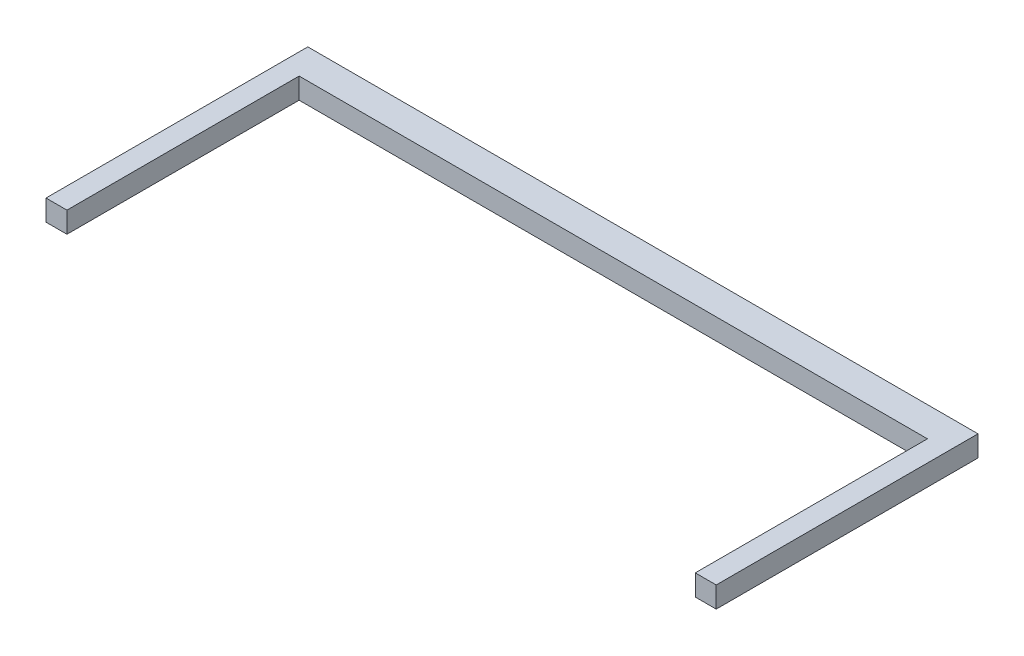
ISO-10303-21;
HEADER;
FILE_DESCRIPTION(('STEP AP214'),'2;1');
FILE_NAME('part.step','',(''),(''),'','','');
FILE_SCHEMA(('AUTOMOTIVE_DESIGN { 1 0 10303 214 1 1 1 1 }'));
ENDSEC;
DATA;
#1=APPLICATION_CONTEXT('core data for automotive mechanical design processes');
#2=APPLICATION_PROTOCOL_DEFINITION('international standard','automotive_design',2000,#1);
#3=PRODUCT_CONTEXT('',#1,'mechanical');
#4=PRODUCT('Part','Part','',(#3));
#5=PRODUCT_RELATED_PRODUCT_CATEGORY('part','',(#4));
#6=PRODUCT_DEFINITION_FORMATION('','',#4);
#7=PRODUCT_DEFINITION_CONTEXT('part definition',#1,'design');
#8=PRODUCT_DEFINITION('design','',#6,#7);
#9=PRODUCT_DEFINITION_SHAPE('','',#8);
#10=(LENGTH_UNIT() NAMED_UNIT(*) SI_UNIT(.MILLI.,.METRE.));
#11=(NAMED_UNIT(*) PLANE_ANGLE_UNIT() SI_UNIT($,.RADIAN.));
#12=(NAMED_UNIT(*) SI_UNIT($,.STERADIAN.) SOLID_ANGLE_UNIT());
#13=UNCERTAINTY_MEASURE_WITH_UNIT(LENGTH_MEASURE(1.E-05),#10,'distance_accuracy_value','');
#14=(GEOMETRIC_REPRESENTATION_CONTEXT(3) GLOBAL_UNCERTAINTY_ASSIGNED_CONTEXT((#13)) GLOBAL_UNIT_ASSIGNED_CONTEXT((#10,
#11,#12)) REPRESENTATION_CONTEXT('',''));
#15=CARTESIAN_POINT('',(0.,0.,0.));
#16=DIRECTION('',(0.,0.,1.));
#17=DIRECTION('',(1.,0.,0.));
#18=AXIS2_PLACEMENT_3D('',#15,#16,#17);
#19=CARTESIAN_POINT('',(0.,20.,0.));
#20=DIRECTION('',(1.,0.,0.));
#21=DIRECTION('',(0.,0.,-1.));
#22=AXIS2_PLACEMENT_3D('',#19,#20,#21);
#23=PLANE('',#22);
#24=DIRECTION('',(0.,0.,1.));
#25=VECTOR('',#24,1.);
#26=CARTESIAN_POINT('',(0.,0.,0.));
#27=LINE('',#26,#25);
#28=CARTESIAN_POINT('',(0.,0.,0.));
#29=VERTEX_POINT('',#28);
#30=CARTESIAN_POINT('',(0.,0.,250.));
#31=VERTEX_POINT('',#30);
#32=EDGE_CURVE('E133',#29,#31,#27,.T.);
#33=ORIENTED_EDGE('',*,*,#32,.T.);
#34=DIRECTION('',(0.,-1.,0.));
#35=VECTOR('',#34,1.);
#36=CARTESIAN_POINT('',(0.,20.,250.));
#37=LINE('',#36,#35);
#38=CARTESIAN_POINT('',(0.,20.,250.));
#39=VERTEX_POINT('',#38);
#40=EDGE_CURVE('E41',#39,#31,#37,.T.);
#41=ORIENTED_EDGE('',*,*,#40,.F.);
#42=DIRECTION('',(0.,0.,1.));
#43=VECTOR('',#42,1.);
#44=CARTESIAN_POINT('',(0.,20.,0.));
#45=LINE('',#44,#43);
#46=CARTESIAN_POINT('',(0.,20.,0.));
#47=VERTEX_POINT('',#46);
#48=EDGE_CURVE('E94',#47,#39,#45,.T.);
#49=ORIENTED_EDGE('',*,*,#48,.F.);
#50=DIRECTION('',(0.,-1.,0.));
#51=VECTOR('',#50,1.);
#52=CARTESIAN_POINT('',(0.,20.,0.));
#53=LINE('',#52,#51);
#54=EDGE_CURVE('E11',#47,#29,#53,.T.);
#55=ORIENTED_EDGE('',*,*,#54,.T.);
#56=EDGE_LOOP('',(#33,#41,#49,#55));
#57=FACE_BOUND('',#56,.T.);
#58=ADVANCED_FACE('F33',(#57),#23,.F.);
#59=CARTESIAN_POINT('',(0.,20.,250.));
#60=DIRECTION('',(0.,0.,-1.));
#61=DIRECTION('',(-1.,0.,0.));
#62=AXIS2_PLACEMENT_3D('',#59,#60,#61);
#63=PLANE('',#62);
#64=DIRECTION('',(1.,0.,0.));
#65=VECTOR('',#64,1.);
#66=CARTESIAN_POINT('',(0.,0.,250.));
#67=LINE('',#66,#65);
#68=CARTESIAN_POINT('',(20.,0.,250.));
#69=VERTEX_POINT('',#68);
#70=EDGE_CURVE('E135',#31,#69,#67,.T.);
#71=ORIENTED_EDGE('',*,*,#70,.T.);
#72=DIRECTION('',(0.,-1.,0.));
#73=VECTOR('',#72,1.);
#74=CARTESIAN_POINT('',(20.,20.,250.));
#75=LINE('',#74,#73);
#76=CARTESIAN_POINT('',(20.,20.,250.));
#77=VERTEX_POINT('',#76);
#78=EDGE_CURVE('E154',#77,#69,#75,.T.);
#79=ORIENTED_EDGE('',*,*,#78,.F.);
#80=DIRECTION('',(1.,0.,0.));
#81=VECTOR('',#80,1.);
#82=CARTESIAN_POINT('',(0.,20.,250.));
#83=LINE('',#82,#81);
#84=EDGE_CURVE('E162',#39,#77,#83,.T.);
#85=ORIENTED_EDGE('',*,*,#84,.F.);
#86=ORIENTED_EDGE('',*,*,#40,.T.);
#87=EDGE_LOOP('',(#71,#79,#85,#86));
#88=FACE_BOUND('',#87,.T.);
#89=ADVANCED_FACE('F160',(#88),#63,.F.);
#90=CARTESIAN_POINT('',(20.,20.,28.2842712474621));
#91=DIRECTION('',(-1.,0.,0.));
#92=DIRECTION('',(0.,0.,1.));
#93=AXIS2_PLACEMENT_3D('',#90,#91,#92);
#94=PLANE('',#93);
#95=DIRECTION('',(0.,0.,-1.));
#96=VECTOR('',#95,1.);
#97=CARTESIAN_POINT('',(20.,0.,28.2842712474621));
#98=LINE('',#97,#96);
#99=CARTESIAN_POINT('',(20.,0.,28.2842712474621));
#100=VERTEX_POINT('',#99);
#101=EDGE_CURVE('E138',#69,#100,#98,.T.);
#102=ORIENTED_EDGE('',*,*,#101,.T.);
#103=DIRECTION('',(0.,-1.,0.));
#104=VECTOR('',#103,1.);
#105=CARTESIAN_POINT('',(20.,20.,28.2842712474621));
#106=LINE('',#105,#104);
#107=CARTESIAN_POINT('',(20.,20.,28.2842712474621));
#108=VERTEX_POINT('',#107);
#109=EDGE_CURVE('E151',#108,#100,#106,.T.);
#110=ORIENTED_EDGE('',*,*,#109,.F.);
#111=DIRECTION('',(0.,0.,-1.));
#112=VECTOR('',#111,1.);
#113=CARTESIAN_POINT('',(20.,20.,230.));
#114=LINE('',#113,#112);
#115=EDGE_CURVE('E171',#77,#108,#114,.T.);
#116=ORIENTED_EDGE('',*,*,#115,.F.);
#117=ORIENTED_EDGE('',*,*,#78,.T.);
#118=EDGE_LOOP('',(#102,#110,#116,#117));
#119=FACE_BOUND('',#118,.T.);
#120=ADVANCED_FACE('F167',(#119),#94,.F.);
#121=CARTESIAN_POINT('',(20.,20.,28.2842712474621));
#122=DIRECTION('',(0.,0.,-1.));
#123=DIRECTION('',(-1.,0.,0.));
#124=AXIS2_PLACEMENT_3D('',#121,#122,#123);
#125=PLANE('',#124);
#126=DIRECTION('',(1.,0.,0.));
#127=VECTOR('',#126,1.);
#128=CARTESIAN_POINT('',(20.,0.,28.2842712474621));
#129=LINE('',#128,#127);
#130=CARTESIAN_POINT('',(620.,0.,28.2842712474621));
#131=VERTEX_POINT('',#130);
#132=EDGE_CURVE('E140',#100,#131,#129,.T.);
#133=ORIENTED_EDGE('',*,*,#132,.T.);
#134=DIRECTION('',(0.,-1.,0.));
#135=VECTOR('',#134,1.);
#136=CARTESIAN_POINT('',(620.,20.,28.2842712474621));
#137=LINE('',#136,#135);
#138=CARTESIAN_POINT('',(620.,20.,28.2842712474621));
#139=VERTEX_POINT('',#138);
#140=EDGE_CURVE('E122',#139,#131,#137,.T.);
#141=ORIENTED_EDGE('',*,*,#140,.F.);
#142=DIRECTION('',(1.,0.,0.));
#143=VECTOR('',#142,1.);
#144=CARTESIAN_POINT('',(20.,20.,28.2842712474621));
#145=LINE('',#144,#143);
#146=EDGE_CURVE('E114',#108,#139,#145,.T.);
#147=ORIENTED_EDGE('',*,*,#146,.F.);
#148=ORIENTED_EDGE('',*,*,#109,.T.);
#149=EDGE_LOOP('',(#133,#141,#147,#148));
#150=FACE_BOUND('',#149,.T.);
#151=ADVANCED_FACE('F170',(#150),#125,.F.);
#152=CARTESIAN_POINT('',(620.,20.,230.));
#153=DIRECTION('',(1.,0.,0.));
#154=DIRECTION('',(0.,0.,-1.));
#155=AXIS2_PLACEMENT_3D('',#152,#153,#154);
#156=PLANE('',#155);
#157=DIRECTION('',(0.,0.,1.));
#158=VECTOR('',#157,1.);
#159=CARTESIAN_POINT('',(620.,0.,230.));
#160=LINE('',#159,#158);
#161=CARTESIAN_POINT('',(620.,0.,250.));
#162=VERTEX_POINT('',#161);
#163=EDGE_CURVE('E121',#131,#162,#160,.T.);
#164=ORIENTED_EDGE('',*,*,#163,.T.);
#165=DIRECTION('',(0.,-1.,0.));
#166=VECTOR('',#165,1.);
#167=CARTESIAN_POINT('',(620.,20.,250.));
#168=LINE('',#167,#166);
#169=CARTESIAN_POINT('',(620.,20.,250.));
#170=VERTEX_POINT('',#169);
#171=EDGE_CURVE('E119',#170,#162,#168,.T.);
#172=ORIENTED_EDGE('',*,*,#171,.F.);
#173=DIRECTION('',(0.,0.,1.));
#174=VECTOR('',#173,1.);
#175=CARTESIAN_POINT('',(620.,20.,230.));
#176=LINE('',#175,#174);
#177=EDGE_CURVE('E108',#139,#170,#176,.T.);
#178=ORIENTED_EDGE('',*,*,#177,.F.);
#179=ORIENTED_EDGE('',*,*,#140,.T.);
#180=EDGE_LOOP('',(#164,#172,#178,#179));
#181=FACE_BOUND('',#180,.T.);
#182=ADVANCED_FACE('F120',(#181),#156,.F.);
#183=CARTESIAN_POINT('',(620.,20.,250.));
#184=DIRECTION('',(0.,0.,-1.));
#185=DIRECTION('',(-1.,0.,0.));
#186=AXIS2_PLACEMENT_3D('',#183,#184,#185);
#187=PLANE('',#186);
#188=DIRECTION('',(1.,0.,0.));
#189=VECTOR('',#188,1.);
#190=CARTESIAN_POINT('',(620.,0.,250.));
#191=LINE('',#190,#189);
#192=CARTESIAN_POINT('',(640.,0.,250.));
#193=VERTEX_POINT('',#192);
#194=EDGE_CURVE('E79',#162,#193,#191,.T.);
#195=ORIENTED_EDGE('',*,*,#194,.T.);
#196=DIRECTION('',(0.,-1.,0.));
#197=VECTOR('',#196,1.);
#198=CARTESIAN_POINT('',(640.,20.,250.));
#199=LINE('',#198,#197);
#200=CARTESIAN_POINT('',(640.,20.,250.));
#201=VERTEX_POINT('',#200);
#202=EDGE_CURVE('E123',#201,#193,#199,.T.);
#203=ORIENTED_EDGE('',*,*,#202,.F.);
#204=DIRECTION('',(1.,0.,0.));
#205=VECTOR('',#204,1.);
#206=CARTESIAN_POINT('',(620.,20.,250.));
#207=LINE('',#206,#205);
#208=EDGE_CURVE('E112',#170,#201,#207,.T.);
#209=ORIENTED_EDGE('',*,*,#208,.F.);
#210=ORIENTED_EDGE('',*,*,#171,.T.);
#211=EDGE_LOOP('',(#195,#203,#209,#210));
#212=FACE_BOUND('',#211,.T.);
#213=ADVANCED_FACE('F125',(#212),#187,.F.);
#214=CARTESIAN_POINT('',(640.,20.,250.));
#215=DIRECTION('',(-1.,0.,0.));
#216=DIRECTION('',(0.,0.,1.));
#217=AXIS2_PLACEMENT_3D('',#214,#215,#216);
#218=PLANE('',#217);
#219=DIRECTION('',(0.,0.,-1.));
#220=VECTOR('',#219,1.);
#221=CARTESIAN_POINT('',(640.,0.,250.));
#222=LINE('',#221,#220);
#223=CARTESIAN_POINT('',(640.,0.,0.));
#224=VERTEX_POINT('',#223);
#225=EDGE_CURVE('E145',#193,#224,#222,.T.);
#226=ORIENTED_EDGE('',*,*,#225,.T.);
#227=DIRECTION('',(0.,-1.,0.));
#228=VECTOR('',#227,1.);
#229=CARTESIAN_POINT('',(640.,20.,0.));
#230=LINE('',#229,#228);
#231=CARTESIAN_POINT('',(640.,20.,0.));
#232=VERTEX_POINT('',#231);
#233=EDGE_CURVE('E129',#232,#224,#230,.T.);
#234=ORIENTED_EDGE('',*,*,#233,.F.);
#235=DIRECTION('',(0.,0.,-1.));
#236=VECTOR('',#235,1.);
#237=CARTESIAN_POINT('',(640.,20.,250.));
#238=LINE('',#237,#236);
#239=EDGE_CURVE('E127',#201,#232,#238,.T.);
#240=ORIENTED_EDGE('',*,*,#239,.F.);
#241=ORIENTED_EDGE('',*,*,#202,.T.);
#242=EDGE_LOOP('',(#226,#234,#240,#241));
#243=FACE_BOUND('',#242,.T.);
#244=ADVANCED_FACE('F193',(#243),#218,.F.);
#245=CARTESIAN_POINT('',(20.,20.,0.));
#246=DIRECTION('',(0.,0.,1.));
#247=DIRECTION('',(1.,0.,0.));
#248=AXIS2_PLACEMENT_3D('',#245,#246,#247);
#249=PLANE('',#248);
#250=DIRECTION('',(-1.,0.,0.));
#251=VECTOR('',#250,1.);
#252=CARTESIAN_POINT('',(20.,0.,0.));
#253=LINE('',#252,#251);
#254=EDGE_CURVE('E86',#224,#29,#253,.T.);
#255=ORIENTED_EDGE('',*,*,#254,.T.);
#256=ORIENTED_EDGE('',*,*,#54,.F.);
#257=DIRECTION('',(-1.,0.,0.));
#258=VECTOR('',#257,1.);
#259=CARTESIAN_POINT('',(0.,20.,0.));
#260=LINE('',#259,#258);
#261=EDGE_CURVE('E49',#232,#47,#260,.T.);
#262=ORIENTED_EDGE('',*,*,#261,.F.);
#263=ORIENTED_EDGE('',*,*,#233,.T.);
#264=EDGE_LOOP('',(#255,#256,#262,#263));
#265=FACE_BOUND('',#264,.T.);
#266=ADVANCED_FACE('F177',(#265),#249,.F.);
#267=CARTESIAN_POINT('',(0.,20.,0.));
#268=DIRECTION('',(0.,1.,0.));
#269=DIRECTION('',(0.,0.,1.));
#270=AXIS2_PLACEMENT_3D('',#267,#268,#269);
#271=PLANE('',#270);
#272=ORIENTED_EDGE('',*,*,#261,.T.);
#273=ORIENTED_EDGE('',*,*,#48,.T.);
#274=ORIENTED_EDGE('',*,*,#84,.T.);
#275=ORIENTED_EDGE('',*,*,#115,.T.);
#276=ORIENTED_EDGE('',*,*,#146,.T.);
#277=ORIENTED_EDGE('',*,*,#177,.T.);
#278=ORIENTED_EDGE('',*,*,#208,.T.);
#279=ORIENTED_EDGE('',*,*,#239,.T.);
#280=EDGE_LOOP('',(#272,#273,#274,#275,#276,#277,#278,#279));
#281=FACE_BOUND('',#280,.T.);
#282=ADVANCED_FACE('F110',(#281),#271,.T.);
#283=CARTESIAN_POINT('',(0.,0.,0.));
#284=DIRECTION('',(0.,1.,0.));
#285=DIRECTION('',(0.,0.,1.));
#286=AXIS2_PLACEMENT_3D('',#283,#284,#285);
#287=PLANE('',#286);
#288=ORIENTED_EDGE('',*,*,#32,.F.);
#289=ORIENTED_EDGE('',*,*,#254,.F.);
#290=ORIENTED_EDGE('',*,*,#225,.F.);
#291=ORIENTED_EDGE('',*,*,#194,.F.);
#292=ORIENTED_EDGE('',*,*,#163,.F.);
#293=ORIENTED_EDGE('',*,*,#132,.F.);
#294=ORIENTED_EDGE('',*,*,#101,.F.);
#295=ORIENTED_EDGE('',*,*,#70,.F.);
#296=EDGE_LOOP('',(#288,#289,#290,#291,#292,#293,#294,#295));
#297=FACE_BOUND('',#296,.T.);
#298=ADVANCED_FACE('F163',(#297),#287,.F.);
#299=CLOSED_SHELL('',(#58,#89,#120,#151,#182,#213,#244,#266,#282,#298));
#300=MANIFOLD_SOLID_BREP('B2',#299);
#301=ADVANCED_BREP_SHAPE_REPRESENTATION('',(#18,#300),#14);
#302=SHAPE_DEFINITION_REPRESENTATION(#9,#301);
ENDSEC;
END-ISO-10303-21;
